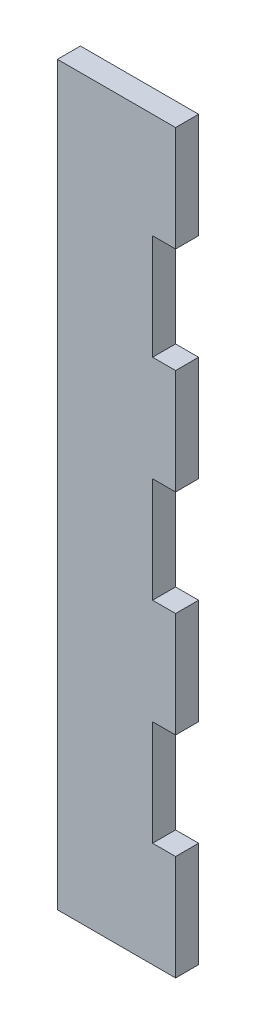
ISO-10303-21;
HEADER;
FILE_DESCRIPTION(('STEP AP214'),'2;1');
FILE_NAME('part.step','',(''),(''),'','','');
FILE_SCHEMA(('AUTOMOTIVE_DESIGN { 1 0 10303 214 1 1 1 1 }'));
ENDSEC;
DATA;
#1=APPLICATION_CONTEXT('core data for automotive mechanical design processes');
#2=APPLICATION_PROTOCOL_DEFINITION('international standard','automotive_design',2000,#1);
#3=PRODUCT_CONTEXT('',#1,'mechanical');
#4=PRODUCT('Part','Part','',(#3));
#5=PRODUCT_RELATED_PRODUCT_CATEGORY('part','',(#4));
#6=PRODUCT_DEFINITION_FORMATION('','',#4);
#7=PRODUCT_DEFINITION_CONTEXT('part definition',#1,'design');
#8=PRODUCT_DEFINITION('design','',#6,#7);
#9=PRODUCT_DEFINITION_SHAPE('','',#8);
#10=(LENGTH_UNIT() NAMED_UNIT(*) SI_UNIT(.MILLI.,.METRE.));
#11=(NAMED_UNIT(*) PLANE_ANGLE_UNIT() SI_UNIT($,.RADIAN.));
#12=(NAMED_UNIT(*) SI_UNIT($,.STERADIAN.) SOLID_ANGLE_UNIT());
#13=UNCERTAINTY_MEASURE_WITH_UNIT(LENGTH_MEASURE(1.E-05),#10,'distance_accuracy_value','');
#14=(GEOMETRIC_REPRESENTATION_CONTEXT(3) GLOBAL_UNCERTAINTY_ASSIGNED_CONTEXT((#13)) GLOBAL_UNIT_ASSIGNED_CONTEXT((#10,
#11,#12)) REPRESENTATION_CONTEXT('',''));
#15=CARTESIAN_POINT('',(0.,0.,0.));
#16=DIRECTION('',(0.,0.,1.));
#17=DIRECTION('',(1.,0.,0.));
#18=AXIS2_PLACEMENT_3D('',#15,#16,#17);
#19=CARTESIAN_POINT('',(0.,-101.6,6.35));
#20=DIRECTION('',(0.,1.,0.));
#21=DIRECTION('',(0.,0.,1.));
#22=AXIS2_PLACEMENT_3D('',#19,#20,#21);
#23=PLANE('',#22);
#24=DIRECTION('',(1.,0.,0.));
#25=VECTOR('',#24,1.);
#26=CARTESIAN_POINT('',(0.,-101.6,0.));
#27=LINE('',#26,#25);
#28=CARTESIAN_POINT('',(-19.91,-101.6,0.));
#29=VERTEX_POINT('',#28);
#30=CARTESIAN_POINT('',(12.7000000000018,-101.6,0.));
#31=VERTEX_POINT('',#30);
#32=EDGE_CURVE('E194',#29,#31,#27,.T.);
#33=ORIENTED_EDGE('',*,*,#32,.T.);
#34=DIRECTION('',(0.,0.,-1.));
#35=VECTOR('',#34,1.);
#36=CARTESIAN_POINT('',(12.7000000000018,-101.6,6.35));
#37=LINE('',#36,#35);
#38=CARTESIAN_POINT('',(12.7000000000018,-101.6,6.35));
#39=VERTEX_POINT('',#38);
#40=EDGE_CURVE('E11',#39,#31,#37,.T.);
#41=ORIENTED_EDGE('',*,*,#40,.F.);
#42=DIRECTION('',(1.,0.,0.));
#43=VECTOR('',#42,1.);
#44=CARTESIAN_POINT('',(0.,-101.6,6.35));
#45=LINE('',#44,#43);
#46=CARTESIAN_POINT('',(-19.91,-101.6,6.35));
#47=VERTEX_POINT('',#46);
#48=EDGE_CURVE('E109',#47,#39,#45,.T.);
#49=ORIENTED_EDGE('',*,*,#48,.F.);
#50=DIRECTION('',(0.,0.,1.));
#51=VECTOR('',#50,1.);
#52=CARTESIAN_POINT('',(-19.91,-101.6,0.));
#53=LINE('',#52,#51);
#54=EDGE_CURVE('E198',#29,#47,#53,.T.);
#55=ORIENTED_EDGE('',*,*,#54,.F.);
#56=EDGE_LOOP('',(#33,#41,#49,#55));
#57=FACE_BOUND('',#56,.T.);
#58=ADVANCED_FACE('F35',(#57),#23,.F.);
#59=CARTESIAN_POINT('',(12.7000000000018,0.,6.35));
#60=DIRECTION('',(1.,0.,0.));
#61=DIRECTION('',(0.,0.,-1.));
#62=AXIS2_PLACEMENT_3D('',#59,#60,#61);
#63=PLANE('',#62);
#64=DIRECTION('',(0.,-1.,0.));
#65=VECTOR('',#64,1.);
#66=CARTESIAN_POINT('',(12.7000000000018,0.,0.));
#67=LINE('',#66,#65);
#68=CARTESIAN_POINT('',(12.7000000000015,-72.5714285714286,0.));
#69=VERTEX_POINT('',#68);
#70=EDGE_CURVE('E254',#69,#31,#67,.T.);
#71=ORIENTED_EDGE('',*,*,#70,.F.);
#72=DIRECTION('',(0.,0.,-1.));
#73=VECTOR('',#72,1.);
#74=CARTESIAN_POINT('',(12.7000000000015,-72.5714285714286,6.35));
#75=LINE('',#74,#73);
#76=CARTESIAN_POINT('',(12.7000000000015,-72.5714285714286,6.35));
#77=VERTEX_POINT('',#76);
#78=EDGE_CURVE('E43',#77,#69,#75,.T.);
#79=ORIENTED_EDGE('',*,*,#78,.F.);
#80=DIRECTION('',(0.,-1.,0.));
#81=VECTOR('',#80,1.);
#82=CARTESIAN_POINT('',(12.7000000000018,0.,6.35));
#83=LINE('',#82,#81);
#84=EDGE_CURVE('E183',#77,#39,#83,.T.);
#85=ORIENTED_EDGE('',*,*,#84,.T.);
#86=ORIENTED_EDGE('',*,*,#40,.T.);
#87=EDGE_LOOP('',(#71,#79,#85,#86));
#88=FACE_BOUND('',#87,.T.);
#89=ADVANCED_FACE('F225',(#88),#63,.T.);
#90=CARTESIAN_POINT('',(0.,-72.5714285714286,6.35));
#91=DIRECTION('',(0.,1.,0.));
#92=DIRECTION('',(0.,0.,1.));
#93=AXIS2_PLACEMENT_3D('',#90,#91,#92);
#94=PLANE('',#93);
#95=DIRECTION('',(1.,0.,0.));
#96=VECTOR('',#95,1.);
#97=CARTESIAN_POINT('',(0.,-72.5714285714286,0.));
#98=LINE('',#97,#96);
#99=CARTESIAN_POINT('',(6.35,-72.5714285714286,0.));
#100=VERTEX_POINT('',#99);
#101=EDGE_CURVE('E256',#100,#69,#98,.T.);
#102=ORIENTED_EDGE('',*,*,#101,.F.);
#103=DIRECTION('',(0.,0.,-1.));
#104=VECTOR('',#103,1.);
#105=CARTESIAN_POINT('',(6.35,-72.5714285714286,6.35));
#106=LINE('',#105,#104);
#107=CARTESIAN_POINT('',(6.35,-72.5714285714286,6.35));
#108=VERTEX_POINT('',#107);
#109=EDGE_CURVE('E296',#108,#100,#106,.T.);
#110=ORIENTED_EDGE('',*,*,#109,.F.);
#111=DIRECTION('',(1.,0.,0.));
#112=VECTOR('',#111,1.);
#113=CARTESIAN_POINT('',(0.,-72.5714285714286,6.35));
#114=LINE('',#113,#112);
#115=EDGE_CURVE('E178',#108,#77,#114,.T.);
#116=ORIENTED_EDGE('',*,*,#115,.T.);
#117=ORIENTED_EDGE('',*,*,#78,.T.);
#118=EDGE_LOOP('',(#102,#110,#116,#117));
#119=FACE_BOUND('',#118,.T.);
#120=ADVANCED_FACE('F298',(#119),#94,.T.);
#121=CARTESIAN_POINT('',(6.35,0.,6.35));
#122=DIRECTION('',(1.,0.,0.));
#123=DIRECTION('',(0.,0.,-1.));
#124=AXIS2_PLACEMENT_3D('',#121,#122,#123);
#125=PLANE('',#124);
#126=DIRECTION('',(0.,-1.,0.));
#127=VECTOR('',#126,1.);
#128=CARTESIAN_POINT('',(6.35,0.,0.));
#129=LINE('',#128,#127);
#130=CARTESIAN_POINT('',(6.35,-43.5428571428572,0.));
#131=VERTEX_POINT('',#130);
#132=EDGE_CURVE('E259',#131,#100,#129,.T.);
#133=ORIENTED_EDGE('',*,*,#132,.F.);
#134=DIRECTION('',(0.,0.,-1.));
#135=VECTOR('',#134,1.);
#136=CARTESIAN_POINT('',(6.35,-43.5428571428572,6.35));
#137=LINE('',#136,#135);
#138=CARTESIAN_POINT('',(6.35,-43.5428571428572,6.35));
#139=VERTEX_POINT('',#138);
#140=EDGE_CURVE('E241',#139,#131,#137,.T.);
#141=ORIENTED_EDGE('',*,*,#140,.F.);
#142=DIRECTION('',(0.,-1.,0.));
#143=VECTOR('',#142,1.);
#144=CARTESIAN_POINT('',(6.35,0.,6.35));
#145=LINE('',#144,#143);
#146=EDGE_CURVE('E168',#139,#108,#145,.T.);
#147=ORIENTED_EDGE('',*,*,#146,.T.);
#148=ORIENTED_EDGE('',*,*,#109,.T.);
#149=EDGE_LOOP('',(#133,#141,#147,#148));
#150=FACE_BOUND('',#149,.T.);
#151=ADVANCED_FACE('F300',(#150),#125,.T.);
#152=CARTESIAN_POINT('',(0.,-43.5428571428572,6.35));
#153=DIRECTION('',(0.,1.,0.));
#154=DIRECTION('',(0.,0.,1.));
#155=AXIS2_PLACEMENT_3D('',#152,#153,#154);
#156=PLANE('',#155);
#157=DIRECTION('',(1.,0.,0.));
#158=VECTOR('',#157,1.);
#159=CARTESIAN_POINT('',(0.,-43.5428571428572,0.));
#160=LINE('',#159,#158);
#161=CARTESIAN_POINT('',(12.7000000000012,-43.5428571428572,0.));
#162=VERTEX_POINT('',#161);
#163=EDGE_CURVE('E237',#131,#162,#160,.T.);
#164=ORIENTED_EDGE('',*,*,#163,.T.);
#165=DIRECTION('',(0.,0.,-1.));
#166=VECTOR('',#165,1.);
#167=CARTESIAN_POINT('',(12.7000000000012,-43.5428571428572,6.35));
#168=LINE('',#167,#166);
#169=CARTESIAN_POINT('',(12.7000000000012,-43.5428571428572,6.35));
#170=VERTEX_POINT('',#169);
#171=EDGE_CURVE('E234',#170,#162,#168,.T.);
#172=ORIENTED_EDGE('',*,*,#171,.F.);
#173=DIRECTION('',(1.,0.,0.));
#174=VECTOR('',#173,1.);
#175=CARTESIAN_POINT('',(0.,-43.5428571428572,6.35));
#176=LINE('',#175,#174);
#177=EDGE_CURVE('E177',#139,#170,#176,.T.);
#178=ORIENTED_EDGE('',*,*,#177,.F.);
#179=ORIENTED_EDGE('',*,*,#140,.T.);
#180=EDGE_LOOP('',(#164,#172,#178,#179));
#181=FACE_BOUND('',#180,.T.);
#182=ADVANCED_FACE('F235',(#181),#156,.F.);
#183=CARTESIAN_POINT('',(12.7000000000012,0.,6.35));
#184=DIRECTION('',(1.,0.,0.));
#185=DIRECTION('',(0.,0.,-1.));
#186=AXIS2_PLACEMENT_3D('',#183,#184,#185);
#187=PLANE('',#186);
#188=DIRECTION('',(0.,-1.,0.));
#189=VECTOR('',#188,1.);
#190=CARTESIAN_POINT('',(12.7000000000012,0.,0.));
#191=LINE('',#190,#189);
#192=CARTESIAN_POINT('',(12.7000000000009,-14.5142857142858,0.));
#193=VERTEX_POINT('',#192);
#194=EDGE_CURVE('E264',#193,#162,#191,.T.);
#195=ORIENTED_EDGE('',*,*,#194,.F.);
#196=DIRECTION('',(0.,0.,-1.));
#197=VECTOR('',#196,1.);
#198=CARTESIAN_POINT('',(12.7000000000009,-14.5142857142858,6.35));
#199=LINE('',#198,#197);
#200=CARTESIAN_POINT('',(12.7000000000009,-14.5142857142858,6.35));
#201=VERTEX_POINT('',#200);
#202=EDGE_CURVE('E242',#201,#193,#199,.T.);
#203=ORIENTED_EDGE('',*,*,#202,.F.);
#204=DIRECTION('',(0.,-1.,0.));
#205=VECTOR('',#204,1.);
#206=CARTESIAN_POINT('',(12.7000000000012,0.,6.35));
#207=LINE('',#206,#205);
#208=EDGE_CURVE('E181',#201,#170,#207,.T.);
#209=ORIENTED_EDGE('',*,*,#208,.T.);
#210=ORIENTED_EDGE('',*,*,#171,.T.);
#211=EDGE_LOOP('',(#195,#203,#209,#210));
#212=FACE_BOUND('',#211,.T.);
#213=ADVANCED_FACE('F244',(#212),#187,.T.);
#214=CARTESIAN_POINT('',(0.,-14.5142857142858,6.35));
#215=DIRECTION('',(0.,1.,0.));
#216=DIRECTION('',(0.,0.,1.));
#217=AXIS2_PLACEMENT_3D('',#214,#215,#216);
#218=PLANE('',#217);
#219=DIRECTION('',(1.,0.,0.));
#220=VECTOR('',#219,1.);
#221=CARTESIAN_POINT('',(0.,-14.5142857142858,0.));
#222=LINE('',#221,#220);
#223=CARTESIAN_POINT('',(6.35,-14.5142857142858,0.));
#224=VERTEX_POINT('',#223);
#225=EDGE_CURVE('E266',#224,#193,#222,.T.);
#226=ORIENTED_EDGE('',*,*,#225,.F.);
#227=DIRECTION('',(0.,0.,-1.));
#228=VECTOR('',#227,1.);
#229=CARTESIAN_POINT('',(6.35,-14.5142857142858,6.35));
#230=LINE('',#229,#228);
#231=CARTESIAN_POINT('',(6.35,-14.5142857142858,6.35));
#232=VERTEX_POINT('',#231);
#233=EDGE_CURVE('E292',#232,#224,#230,.T.);
#234=ORIENTED_EDGE('',*,*,#233,.F.);
#235=DIRECTION('',(1.,0.,0.));
#236=VECTOR('',#235,1.);
#237=CARTESIAN_POINT('',(0.,-14.5142857142858,6.35));
#238=LINE('',#237,#236);
#239=EDGE_CURVE('E175',#232,#201,#238,.T.);
#240=ORIENTED_EDGE('',*,*,#239,.T.);
#241=ORIENTED_EDGE('',*,*,#202,.T.);
#242=EDGE_LOOP('',(#226,#234,#240,#241));
#243=FACE_BOUND('',#242,.T.);
#244=ADVANCED_FACE('F314',(#243),#218,.T.);
#245=CARTESIAN_POINT('',(6.35,14.5142857142857,0.));
#246=VERTEX_POINT('',#245);
#247=EDGE_CURVE('E262',#246,#224,#129,.T.);
#248=ORIENTED_EDGE('',*,*,#247,.F.);
#249=DIRECTION('',(0.,0.,-1.));
#250=VECTOR('',#249,1.);
#251=CARTESIAN_POINT('',(6.35,14.5142857142857,6.35));
#252=LINE('',#251,#250);
#253=CARTESIAN_POINT('',(6.35,14.5142857142857,6.35));
#254=VERTEX_POINT('',#253);
#255=EDGE_CURVE('E290',#254,#246,#252,.T.);
#256=ORIENTED_EDGE('',*,*,#255,.F.);
#257=EDGE_CURVE('E167',#254,#232,#145,.T.);
#258=ORIENTED_EDGE('',*,*,#257,.T.);
#259=ORIENTED_EDGE('',*,*,#233,.T.);
#260=EDGE_LOOP('',(#248,#256,#258,#259));
#261=FACE_BOUND('',#260,.T.);
#262=ADVANCED_FACE('F303',(#261),#125,.T.);
#263=CARTESIAN_POINT('',(0.,14.5142857142857,6.35));
#264=DIRECTION('',(0.,1.,0.));
#265=DIRECTION('',(0.,0.,1.));
#266=AXIS2_PLACEMENT_3D('',#263,#264,#265);
#267=PLANE('',#266);
#268=DIRECTION('',(1.,0.,0.));
#269=VECTOR('',#268,1.);
#270=CARTESIAN_POINT('',(0.,14.5142857142857,0.));
#271=LINE('',#270,#269);
#272=CARTESIAN_POINT('',(12.7000000000006,14.5142857142857,0.));
#273=VERTEX_POINT('',#272);
#274=EDGE_CURVE('E269',#246,#273,#271,.T.);
#275=ORIENTED_EDGE('',*,*,#274,.T.);
#276=DIRECTION('',(0.,0.,-1.));
#277=VECTOR('',#276,1.);
#278=CARTESIAN_POINT('',(12.7000000000006,14.5142857142857,6.35));
#279=LINE('',#278,#277);
#280=CARTESIAN_POINT('',(12.7000000000006,14.5142857142857,6.35));
#281=VERTEX_POINT('',#280);
#282=EDGE_CURVE('E288',#281,#273,#279,.T.);
#283=ORIENTED_EDGE('',*,*,#282,.F.);
#284=DIRECTION('',(1.,0.,0.));
#285=VECTOR('',#284,1.);
#286=CARTESIAN_POINT('',(0.,14.5142857142857,6.35));
#287=LINE('',#286,#285);
#288=EDGE_CURVE('E174',#254,#281,#287,.T.);
#289=ORIENTED_EDGE('',*,*,#288,.F.);
#290=ORIENTED_EDGE('',*,*,#255,.T.);
#291=EDGE_LOOP('',(#275,#283,#289,#290));
#292=FACE_BOUND('',#291,.T.);
#293=ADVANCED_FACE('F313',(#292),#267,.F.);
#294=CARTESIAN_POINT('',(12.7000000000006,0.,6.35));
#295=DIRECTION('',(1.,0.,0.));
#296=DIRECTION('',(0.,0.,-1.));
#297=AXIS2_PLACEMENT_3D('',#294,#295,#296);
#298=PLANE('',#297);
#299=DIRECTION('',(0.,-1.,0.));
#300=VECTOR('',#299,1.);
#301=CARTESIAN_POINT('',(12.7000000000006,0.,0.));
#302=LINE('',#301,#300);
#303=CARTESIAN_POINT('',(12.7000000000003,43.5428571428571,0.));
#304=VERTEX_POINT('',#303);
#305=EDGE_CURVE('E272',#304,#273,#302,.T.);
#306=ORIENTED_EDGE('',*,*,#305,.F.);
#307=DIRECTION('',(0.,0.,-1.));
#308=VECTOR('',#307,1.);
#309=CARTESIAN_POINT('',(12.7000000000003,43.5428571428571,6.35));
#310=LINE('',#309,#308);
#311=CARTESIAN_POINT('',(12.7000000000003,43.5428571428571,6.35));
#312=VERTEX_POINT('',#311);
#313=EDGE_CURVE('E286',#312,#304,#310,.T.);
#314=ORIENTED_EDGE('',*,*,#313,.F.);
#315=DIRECTION('',(0.,-1.,0.));
#316=VECTOR('',#315,1.);
#317=CARTESIAN_POINT('',(12.7000000000006,0.,6.35));
#318=LINE('',#317,#316);
#319=EDGE_CURVE('E169',#312,#281,#318,.T.);
#320=ORIENTED_EDGE('',*,*,#319,.T.);
#321=ORIENTED_EDGE('',*,*,#282,.T.);
#322=EDGE_LOOP('',(#306,#314,#320,#321));
#323=FACE_BOUND('',#322,.T.);
#324=ADVANCED_FACE('F332',(#323),#298,.T.);
#325=CARTESIAN_POINT('',(0.,43.5428571428571,6.35));
#326=DIRECTION('',(0.,1.,0.));
#327=DIRECTION('',(0.,0.,1.));
#328=AXIS2_PLACEMENT_3D('',#325,#326,#327);
#329=PLANE('',#328);
#330=DIRECTION('',(1.,0.,0.));
#331=VECTOR('',#330,1.);
#332=CARTESIAN_POINT('',(0.,43.5428571428571,0.));
#333=LINE('',#332,#331);
#334=CARTESIAN_POINT('',(6.35,43.5428571428571,0.));
#335=VERTEX_POINT('',#334);
#336=EDGE_CURVE('E275',#335,#304,#333,.T.);
#337=ORIENTED_EDGE('',*,*,#336,.F.);
#338=DIRECTION('',(0.,0.,-1.));
#339=VECTOR('',#338,1.);
#340=CARTESIAN_POINT('',(6.35,43.5428571428571,6.35));
#341=LINE('',#340,#339);
#342=CARTESIAN_POINT('',(6.35,43.5428571428571,6.35));
#343=VERTEX_POINT('',#342);
#344=EDGE_CURVE('E155',#343,#335,#341,.T.);
#345=ORIENTED_EDGE('',*,*,#344,.F.);
#346=DIRECTION('',(1.,0.,0.));
#347=VECTOR('',#346,1.);
#348=CARTESIAN_POINT('',(0.,43.5428571428571,6.35));
#349=LINE('',#348,#347);
#350=EDGE_CURVE('E165',#343,#312,#349,.T.);
#351=ORIENTED_EDGE('',*,*,#350,.T.);
#352=ORIENTED_EDGE('',*,*,#313,.T.);
#353=EDGE_LOOP('',(#337,#345,#351,#352));
#354=FACE_BOUND('',#353,.T.);
#355=ADVANCED_FACE('F317',(#354),#329,.T.);
#356=CARTESIAN_POINT('',(6.35,72.5714285714285,0.));
#357=VERTEX_POINT('',#356);
#358=EDGE_CURVE('E152',#357,#335,#129,.T.);
#359=ORIENTED_EDGE('',*,*,#358,.F.);
#360=DIRECTION('',(0.,0.,-1.));
#361=VECTOR('',#360,1.);
#362=CARTESIAN_POINT('',(6.35,72.5714285714285,6.35));
#363=LINE('',#362,#361);
#364=CARTESIAN_POINT('',(6.35,72.5714285714285,6.35));
#365=VERTEX_POINT('',#364);
#366=EDGE_CURVE('E146',#365,#357,#363,.T.);
#367=ORIENTED_EDGE('',*,*,#366,.F.);
#368=EDGE_CURVE('E150',#365,#343,#145,.T.);
#369=ORIENTED_EDGE('',*,*,#368,.T.);
#370=ORIENTED_EDGE('',*,*,#344,.T.);
#371=EDGE_LOOP('',(#359,#367,#369,#370));
#372=FACE_BOUND('',#371,.T.);
#373=ADVANCED_FACE('F148',(#372),#125,.T.);
#374=CARTESIAN_POINT('',(0.,72.5714285714285,6.35));
#375=DIRECTION('',(0.,1.,0.));
#376=DIRECTION('',(0.,0.,1.));
#377=AXIS2_PLACEMENT_3D('',#374,#375,#376);
#378=PLANE('',#377);
#379=DIRECTION('',(1.,0.,0.));
#380=VECTOR('',#379,1.);
#381=CARTESIAN_POINT('',(0.,72.5714285714285,0.));
#382=LINE('',#381,#380);
#383=CARTESIAN_POINT('',(12.7,72.5714285714285,0.));
#384=VERTEX_POINT('',#383);
#385=EDGE_CURVE('E278',#357,#384,#382,.T.);
#386=ORIENTED_EDGE('',*,*,#385,.T.);
#387=DIRECTION('',(0.,0.,-1.));
#388=VECTOR('',#387,1.);
#389=CARTESIAN_POINT('',(12.7,72.5714285714285,6.35));
#390=LINE('',#389,#388);
#391=CARTESIAN_POINT('',(12.7,72.5714285714285,6.35));
#392=VERTEX_POINT('',#391);
#393=EDGE_CURVE('E96',#392,#384,#390,.T.);
#394=ORIENTED_EDGE('',*,*,#393,.F.);
#395=DIRECTION('',(1.,0.,0.));
#396=VECTOR('',#395,1.);
#397=CARTESIAN_POINT('',(0.,72.5714285714285,6.35));
#398=LINE('',#397,#396);
#399=EDGE_CURVE('E157',#365,#392,#398,.T.);
#400=ORIENTED_EDGE('',*,*,#399,.F.);
#401=ORIENTED_EDGE('',*,*,#366,.T.);
#402=EDGE_LOOP('',(#386,#394,#400,#401));
#403=FACE_BOUND('',#402,.T.);
#404=ADVANCED_FACE('F158',(#403),#378,.F.);
#405=CARTESIAN_POINT('',(12.7,0.,6.35));
#406=DIRECTION('',(1.,0.,0.));
#407=DIRECTION('',(0.,0.,-1.));
#408=AXIS2_PLACEMENT_3D('',#405,#406,#407);
#409=PLANE('',#408);
#410=DIRECTION('',(0.,-1.,0.));
#411=VECTOR('',#410,1.);
#412=CARTESIAN_POINT('',(12.7,0.,0.));
#413=LINE('',#412,#411);
#414=CARTESIAN_POINT('',(12.7,101.6,0.));
#415=VERTEX_POINT('',#414);
#416=EDGE_CURVE('E280',#415,#384,#413,.T.);
#417=ORIENTED_EDGE('',*,*,#416,.F.);
#418=DIRECTION('',(0.,0.,-1.));
#419=VECTOR('',#418,1.);
#420=CARTESIAN_POINT('',(12.7,101.6,6.35));
#421=LINE('',#420,#419);
#422=CARTESIAN_POINT('',(12.7,101.6,6.35));
#423=VERTEX_POINT('',#422);
#424=EDGE_CURVE('E51',#423,#415,#421,.T.);
#425=ORIENTED_EDGE('',*,*,#424,.F.);
#426=DIRECTION('',(0.,-1.,0.));
#427=VECTOR('',#426,1.);
#428=CARTESIAN_POINT('',(12.7,0.,6.35));
#429=LINE('',#428,#427);
#430=EDGE_CURVE('E159',#423,#392,#429,.T.);
#431=ORIENTED_EDGE('',*,*,#430,.T.);
#432=ORIENTED_EDGE('',*,*,#393,.T.);
#433=EDGE_LOOP('',(#417,#425,#431,#432));
#434=FACE_BOUND('',#433,.T.);
#435=ADVANCED_FACE('F349',(#434),#409,.T.);
#436=CARTESIAN_POINT('',(0.,101.6,6.35));
#437=DIRECTION('',(0.,1.,0.));
#438=DIRECTION('',(0.,0.,1.));
#439=AXIS2_PLACEMENT_3D('',#436,#437,#438);
#440=PLANE('',#439);
#441=DIRECTION('',(1.,0.,0.));
#442=VECTOR('',#441,1.);
#443=CARTESIAN_POINT('',(0.,101.6,0.));
#444=LINE('',#443,#442);
#445=CARTESIAN_POINT('',(-19.91,101.6,0.));
#446=VERTEX_POINT('',#445);
#447=EDGE_CURVE('E190',#446,#415,#444,.T.);
#448=ORIENTED_EDGE('',*,*,#447,.F.);
#449=DIRECTION('',(0.,0.,-1.));
#450=VECTOR('',#449,1.);
#451=CARTESIAN_POINT('',(-19.91,101.6,0.));
#452=LINE('',#451,#450);
#453=CARTESIAN_POINT('',(-19.91,101.6,6.34999999999997));
#454=VERTEX_POINT('',#453);
#455=EDGE_CURVE('E191',#454,#446,#452,.T.);
#456=ORIENTED_EDGE('',*,*,#455,.F.);
#457=DIRECTION('',(1.,0.,0.));
#458=VECTOR('',#457,1.);
#459=CARTESIAN_POINT('',(0.,101.6,6.35));
#460=LINE('',#459,#458);
#461=EDGE_CURVE('E220',#454,#423,#460,.T.);
#462=ORIENTED_EDGE('',*,*,#461,.T.);
#463=ORIENTED_EDGE('',*,*,#424,.T.);
#464=EDGE_LOOP('',(#448,#456,#462,#463));
#465=FACE_BOUND('',#464,.T.);
#466=ADVANCED_FACE('F351',(#465),#440,.T.);
#467=CARTESIAN_POINT('',(0.,0.,6.35));
#468=DIRECTION('',(0.,0.,1.));
#469=DIRECTION('',(1.,0.,0.));
#470=AXIS2_PLACEMENT_3D('',#467,#468,#469);
#471=PLANE('',#470);
#472=ORIENTED_EDGE('',*,*,#48,.T.);
#473=ORIENTED_EDGE('',*,*,#84,.F.);
#474=ORIENTED_EDGE('',*,*,#115,.F.);
#475=ORIENTED_EDGE('',*,*,#146,.F.);
#476=ORIENTED_EDGE('',*,*,#177,.T.);
#477=ORIENTED_EDGE('',*,*,#208,.F.);
#478=ORIENTED_EDGE('',*,*,#239,.F.);
#479=ORIENTED_EDGE('',*,*,#257,.F.);
#480=ORIENTED_EDGE('',*,*,#288,.T.);
#481=ORIENTED_EDGE('',*,*,#319,.F.);
#482=ORIENTED_EDGE('',*,*,#350,.F.);
#483=ORIENTED_EDGE('',*,*,#368,.F.);
#484=ORIENTED_EDGE('',*,*,#399,.T.);
#485=ORIENTED_EDGE('',*,*,#430,.F.);
#486=ORIENTED_EDGE('',*,*,#461,.F.);
#487=DIRECTION('',(0.,1.,0.));
#488=VECTOR('',#487,1.);
#489=CARTESIAN_POINT('',(-19.91,101.6,6.34999999999997));
#490=LINE('',#489,#488);
#491=EDGE_CURVE('E195',#47,#454,#490,.T.);
#492=ORIENTED_EDGE('',*,*,#491,.F.);
#493=EDGE_LOOP('',(#472,#473,#474,#475,#476,#477,#478,#479,#480,#481,#482,#483,#484,#485,#486,#492));
#494=FACE_BOUND('',#493,.T.);
#495=ADVANCED_FACE('F162',(#494),#471,.T.);
#496=CARTESIAN_POINT('',(0.,0.,0.));
#497=DIRECTION('',(0.,0.,1.));
#498=DIRECTION('',(1.,0.,0.));
#499=AXIS2_PLACEMENT_3D('',#496,#497,#498);
#500=PLANE('',#499);
#501=ORIENTED_EDGE('',*,*,#32,.F.);
#502=DIRECTION('',(0.,-1.,0.));
#503=VECTOR('',#502,1.);
#504=CARTESIAN_POINT('',(-19.91,101.6,0.));
#505=LINE('',#504,#503);
#506=EDGE_CURVE('E201',#446,#29,#505,.T.);
#507=ORIENTED_EDGE('',*,*,#506,.F.);
#508=ORIENTED_EDGE('',*,*,#447,.T.);
#509=ORIENTED_EDGE('',*,*,#416,.T.);
#510=ORIENTED_EDGE('',*,*,#385,.F.);
#511=ORIENTED_EDGE('',*,*,#358,.T.);
#512=ORIENTED_EDGE('',*,*,#336,.T.);
#513=ORIENTED_EDGE('',*,*,#305,.T.);
#514=ORIENTED_EDGE('',*,*,#274,.F.);
#515=ORIENTED_EDGE('',*,*,#247,.T.);
#516=ORIENTED_EDGE('',*,*,#225,.T.);
#517=ORIENTED_EDGE('',*,*,#194,.T.);
#518=ORIENTED_EDGE('',*,*,#163,.F.);
#519=ORIENTED_EDGE('',*,*,#132,.T.);
#520=ORIENTED_EDGE('',*,*,#101,.T.);
#521=ORIENTED_EDGE('',*,*,#70,.T.);
#522=EDGE_LOOP('',(#501,#507,#508,#509,#510,#511,#512,#513,#514,#515,#516,#517,#518,#519,#520,#521));
#523=FACE_BOUND('',#522,.T.);
#524=ADVANCED_FACE('F214',(#523),#500,.F.);
#525=CARTESIAN_POINT('',(-19.91,0.,0.));
#526=DIRECTION('',(-1.,0.,0.));
#527=DIRECTION('',(0.,0.,1.));
#528=AXIS2_PLACEMENT_3D('',#525,#526,#527);
#529=PLANE('',#528);
#530=ORIENTED_EDGE('',*,*,#506,.T.);
#531=ORIENTED_EDGE('',*,*,#54,.T.);
#532=ORIENTED_EDGE('',*,*,#491,.T.);
#533=ORIENTED_EDGE('',*,*,#455,.T.);
#534=EDGE_LOOP('',(#530,#531,#532,#533));
#535=FACE_BOUND('',#534,.T.);
#536=ADVANCED_FACE('F206',(#535),#529,.T.);
#537=CLOSED_SHELL('',(#58,#89,#120,#151,#182,#213,#244,#262,#293,#324,#355,#373,#404,#435,#466,
#495,#524,#536));
#538=MANIFOLD_SOLID_BREP('B2',#537);
#539=ADVANCED_BREP_SHAPE_REPRESENTATION('',(#18,#538),#14);
#540=SHAPE_DEFINITION_REPRESENTATION(#9,#539);
ENDSEC;
END-ISO-10303-21;
